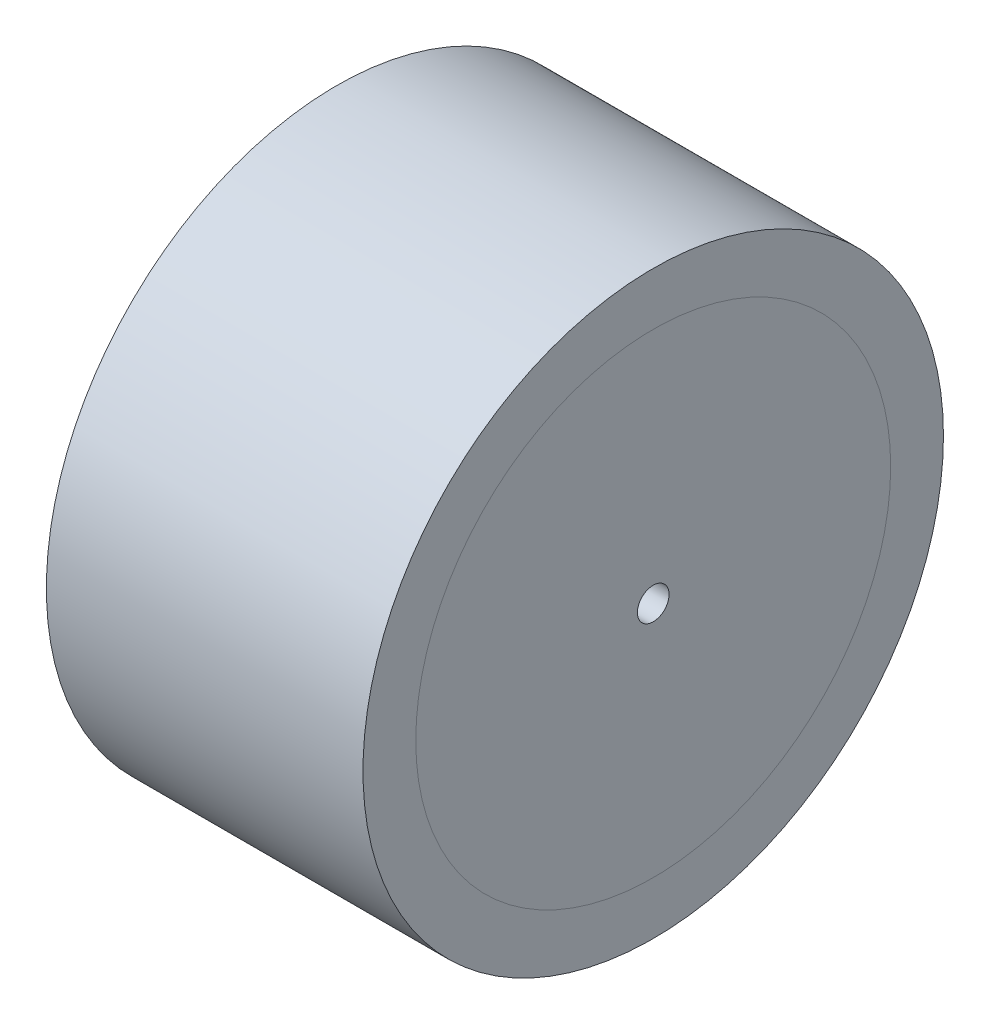
ISO-10303-21;
HEADER;
FILE_DESCRIPTION(('STEP AP214'),'2;1');
FILE_NAME('part.step','',(''),(''),'','','');
FILE_SCHEMA(('AUTOMOTIVE_DESIGN { 1 0 10303 214 1 1 1 1 }'));
ENDSEC;
DATA;
#1=APPLICATION_CONTEXT('core data for automotive mechanical design processes');
#2=APPLICATION_PROTOCOL_DEFINITION('international standard','automotive_design',2000,#1);
#3=PRODUCT_CONTEXT('',#1,'mechanical');
#4=PRODUCT('Part','Part','',(#3));
#5=PRODUCT_RELATED_PRODUCT_CATEGORY('part','',(#4));
#6=PRODUCT_DEFINITION_FORMATION('','',#4);
#7=PRODUCT_DEFINITION_CONTEXT('part definition',#1,'design');
#8=PRODUCT_DEFINITION('design','',#6,#7);
#9=PRODUCT_DEFINITION_SHAPE('','',#8);
#10=(LENGTH_UNIT() NAMED_UNIT(*) SI_UNIT(.MILLI.,.METRE.));
#11=(NAMED_UNIT(*) PLANE_ANGLE_UNIT() SI_UNIT($,.RADIAN.));
#12=(NAMED_UNIT(*) SI_UNIT($,.STERADIAN.) SOLID_ANGLE_UNIT());
#13=UNCERTAINTY_MEASURE_WITH_UNIT(LENGTH_MEASURE(1.E-05),#10,'distance_accuracy_value','');
#14=(GEOMETRIC_REPRESENTATION_CONTEXT(3) GLOBAL_UNCERTAINTY_ASSIGNED_CONTEXT((#13)) GLOBAL_UNIT_ASSIGNED_CONTEXT((#10,
#11,#12)) REPRESENTATION_CONTEXT('',''));
#15=CARTESIAN_POINT('',(0.,0.,0.));
#16=DIRECTION('',(0.,0.,1.));
#17=DIRECTION('',(1.,0.,0.));
#18=AXIS2_PLACEMENT_3D('',#15,#16,#17);
#19=CARTESIAN_POINT('',(0.,0.,0.));
#20=DIRECTION('',(1.,0.,0.));
#21=DIRECTION('',(0.,0.,-1.));
#22=AXIS2_PLACEMENT_3D('',#19,#20,#21);
#23=PLANE('',#22);
#24=CARTESIAN_POINT('',(0.,0.,0.));
#25=DIRECTION('',(1.,0.,0.));
#26=DIRECTION('',(0.,0.,-1.));
#27=AXIS2_PLACEMENT_3D('',#24,#25,#26);
#28=CIRCLE('',#27,27.5);
#29=CARTESIAN_POINT('',(0.,0.,-27.5));
#30=VERTEX_POINT('',#29);
#31=EDGE_CURVE('E58',#30,#30,#28,.T.);
#32=ORIENTED_EDGE('',*,*,#31,.F.);
#33=EDGE_LOOP('',(#32));
#34=FACE_BOUND('',#33,.T.);
#35=CARTESIAN_POINT('',(0.,0.,0.));
#36=DIRECTION('',(1.,0.,0.));
#37=DIRECTION('',(0.,0.,-1.));
#38=AXIS2_PLACEMENT_3D('',#35,#36,#37);
#39=CIRCLE('',#38,22.5);
#40=CARTESIAN_POINT('',(0.,0.,-22.5));
#41=VERTEX_POINT('',#40);
#42=EDGE_CURVE('E10',#41,#41,#39,.F.);
#43=ORIENTED_EDGE('',*,*,#42,.F.);
#44=EDGE_LOOP('',(#43));
#45=FACE_BOUND('',#44,.T.);
#46=ADVANCED_FACE('F41',(#34,#45),#23,.F.);
#47=CARTESIAN_POINT('',(30.,0.,0.));
#48=DIRECTION('',(1.,0.,0.));
#49=DIRECTION('',(0.,0.,-1.));
#50=AXIS2_PLACEMENT_3D('',#47,#48,#49);
#51=PLANE('',#50);
#52=CARTESIAN_POINT('',(30.,0.,0.));
#53=DIRECTION('',(1.,0.,0.));
#54=DIRECTION('',(0.,0.,-1.));
#55=AXIS2_PLACEMENT_3D('',#52,#53,#54);
#56=CIRCLE('',#55,27.5);
#57=CARTESIAN_POINT('',(30.,0.,-27.5));
#58=VERTEX_POINT('',#57);
#59=EDGE_CURVE('E56',#58,#58,#56,.T.);
#60=ORIENTED_EDGE('',*,*,#59,.T.);
#61=EDGE_LOOP('',(#60));
#62=FACE_BOUND('',#61,.T.);
#63=CARTESIAN_POINT('',(30.,0.,0.));
#64=DIRECTION('',(1.,0.,0.));
#65=DIRECTION('',(0.,0.,-1.));
#66=AXIS2_PLACEMENT_3D('',#63,#64,#65);
#67=CIRCLE('',#66,22.5);
#68=CARTESIAN_POINT('',(30.,0.,-22.5));
#69=VERTEX_POINT('',#68);
#70=EDGE_CURVE('E45',#69,#69,#67,.F.);
#71=ORIENTED_EDGE('',*,*,#70,.T.);
#72=EDGE_LOOP('',(#71));
#73=FACE_BOUND('',#72,.T.);
#74=ADVANCED_FACE('F85',(#62,#73),#51,.T.);
#75=CARTESIAN_POINT('',(30.,0.,0.));
#76=DIRECTION('',(-1.,0.,0.));
#77=DIRECTION('',(0.,0.,1.));
#78=AXIS2_PLACEMENT_3D('',#75,#76,#77);
#79=CYLINDRICAL_SURFACE('',#78,27.5);
#80=ORIENTED_EDGE('',*,*,#59,.F.);
#81=EDGE_LOOP('',(#80));
#82=FACE_BOUND('',#81,.T.);
#83=ORIENTED_EDGE('',*,*,#31,.T.);
#84=EDGE_LOOP('',(#83));
#85=FACE_BOUND('',#84,.T.);
#86=ADVANCED_FACE('F43',(#82,#85),#79,.T.);
#87=CARTESIAN_POINT('',(30.,0.,0.));
#88=DIRECTION('',(-1.,0.,0.));
#89=DIRECTION('',(0.,0.,1.));
#90=AXIS2_PLACEMENT_3D('',#87,#88,#89);
#91=CIRCLE('',#90,1.5);
#92=CARTESIAN_POINT('',(30.,0.,1.5));
#93=VERTEX_POINT('',#92);
#94=EDGE_CURVE('E61',#93,#93,#91,.T.);
#95=ORIENTED_EDGE('',*,*,#94,.T.);
#96=EDGE_LOOP('',(#95));
#97=FACE_BOUND('',#96,.T.);
#98=ORIENTED_EDGE('',*,*,#70,.F.);
#99=EDGE_LOOP('',(#98));
#100=FACE_BOUND('',#99,.T.);
#101=ADVANCED_FACE('F70',(#97,#100),#51,.T.);
#102=CARTESIAN_POINT('',(0.,0.,0.));
#103=DIRECTION('',(-1.,0.,0.));
#104=DIRECTION('',(0.,0.,1.));
#105=AXIS2_PLACEMENT_3D('',#102,#103,#104);
#106=CIRCLE('',#105,1.5);
#107=CARTESIAN_POINT('',(0.,0.,1.5));
#108=VERTEX_POINT('',#107);
#109=EDGE_CURVE('E64',#108,#108,#106,.T.);
#110=ORIENTED_EDGE('',*,*,#109,.F.);
#111=EDGE_LOOP('',(#110));
#112=FACE_BOUND('',#111,.T.);
#113=ORIENTED_EDGE('',*,*,#42,.T.);
#114=EDGE_LOOP('',(#113));
#115=FACE_BOUND('',#114,.T.);
#116=ADVANCED_FACE('F76',(#112,#115),#23,.F.);
#117=CARTESIAN_POINT('',(30.,0.,0.));
#118=DIRECTION('',(-1.,0.,0.));
#119=DIRECTION('',(0.,0.,1.));
#120=AXIS2_PLACEMENT_3D('',#117,#118,#119);
#121=CYLINDRICAL_SURFACE('',#120,1.5);
#122=ORIENTED_EDGE('',*,*,#94,.F.);
#123=EDGE_LOOP('',(#122));
#124=FACE_BOUND('',#123,.T.);
#125=ORIENTED_EDGE('',*,*,#109,.T.);
#126=EDGE_LOOP('',(#125));
#127=FACE_BOUND('',#126,.T.);
#128=ADVANCED_FACE('F73',(#124,#127),#121,.F.);
#129=CLOSED_SHELL('',(#46,#74,#86,#101,#116,#128));
#130=MANIFOLD_SOLID_BREP('B2',#129);
#131=ADVANCED_BREP_SHAPE_REPRESENTATION('',(#18,#130),#14);
#132=SHAPE_DEFINITION_REPRESENTATION(#9,#131);
ENDSEC;
END-ISO-10303-21;
